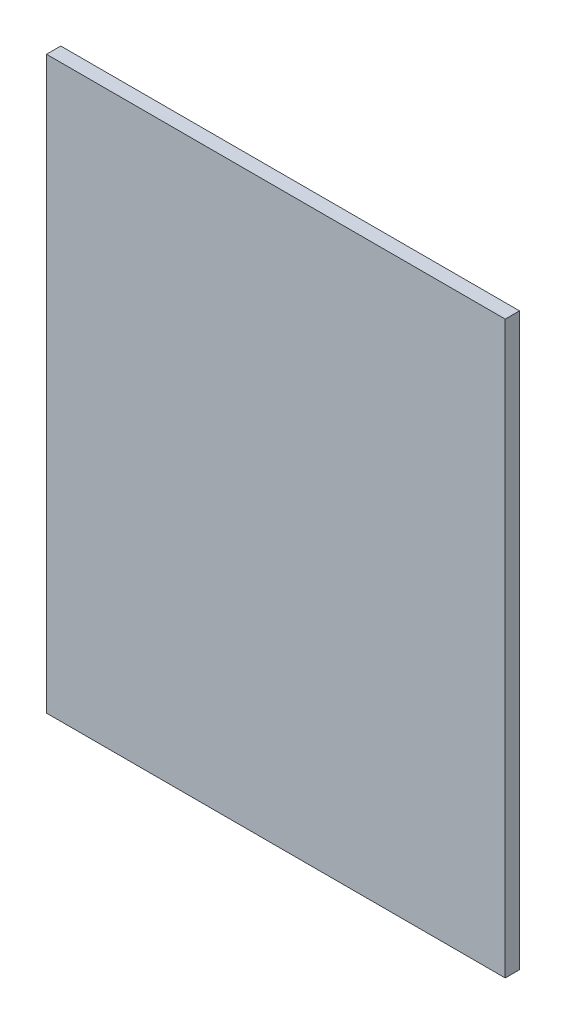
ISO-10303-21;
HEADER;
FILE_DESCRIPTION(('STEP AP214'),'2;1');
FILE_NAME('part.step','',(''),(''),'','','');
FILE_SCHEMA(('AUTOMOTIVE_DESIGN { 1 0 10303 214 1 1 1 1 }'));
ENDSEC;
DATA;
#1=APPLICATION_CONTEXT('core data for automotive mechanical design processes');
#2=APPLICATION_PROTOCOL_DEFINITION('international standard','automotive_design',2000,#1);
#3=PRODUCT_CONTEXT('',#1,'mechanical');
#4=PRODUCT('Part','Part','',(#3));
#5=PRODUCT_RELATED_PRODUCT_CATEGORY('part','',(#4));
#6=PRODUCT_DEFINITION_FORMATION('','',#4);
#7=PRODUCT_DEFINITION_CONTEXT('part definition',#1,'design');
#8=PRODUCT_DEFINITION('design','',#6,#7);
#9=PRODUCT_DEFINITION_SHAPE('','',#8);
#10=(LENGTH_UNIT() NAMED_UNIT(*) SI_UNIT(.MILLI.,.METRE.));
#11=(NAMED_UNIT(*) PLANE_ANGLE_UNIT() SI_UNIT($,.RADIAN.));
#12=(NAMED_UNIT(*) SI_UNIT($,.STERADIAN.) SOLID_ANGLE_UNIT());
#13=UNCERTAINTY_MEASURE_WITH_UNIT(LENGTH_MEASURE(1.E-05),#10,'distance_accuracy_value','');
#14=(GEOMETRIC_REPRESENTATION_CONTEXT(3) GLOBAL_UNCERTAINTY_ASSIGNED_CONTEXT((#13)) GLOBAL_UNIT_ASSIGNED_CONTEXT((#10,
#11,#12)) REPRESENTATION_CONTEXT('',''));
#15=CARTESIAN_POINT('',(0.,0.,0.));
#16=DIRECTION('',(0.,0.,1.));
#17=DIRECTION('',(1.,0.,0.));
#18=AXIS2_PLACEMENT_3D('',#15,#16,#17);
#19=CARTESIAN_POINT('',(-0.476620385333554,100.,8.74094370282377));
#20=DIRECTION('',(1.,0.,0.));
#21=DIRECTION('',(0.,0.,-1.));
#22=AXIS2_PLACEMENT_3D('',#19,#20,#21);
#23=PLANE('',#22);
#24=DIRECTION('',(0.,0.,1.));
#25=VECTOR('',#24,1.);
#26=CARTESIAN_POINT('',(-0.476620385333554,0.,8.74094370282377));
#27=LINE('',#26,#25);
#28=CARTESIAN_POINT('',(-0.476620385333554,0.,8.74094370282377));
#29=VERTEX_POINT('',#28);
#30=CARTESIAN_POINT('',(-0.476620385333554,0.,11.2409437028238));
#31=VERTEX_POINT('',#30);
#32=EDGE_CURVE('E94',#29,#31,#27,.T.);
#33=ORIENTED_EDGE('',*,*,#32,.T.);
#34=DIRECTION('',(0.,-1.,0.));
#35=VECTOR('',#34,1.);
#36=CARTESIAN_POINT('',(-0.476620385333554,100.,11.2409437028238));
#37=LINE('',#36,#35);
#38=CARTESIAN_POINT('',(-0.476620385333554,100.,11.2409437028238));
#39=VERTEX_POINT('',#38);
#40=EDGE_CURVE('E11',#39,#31,#37,.T.);
#41=ORIENTED_EDGE('',*,*,#40,.F.);
#42=DIRECTION('',(0.,0.,1.));
#43=VECTOR('',#42,1.);
#44=CARTESIAN_POINT('',(-0.476620385333554,100.,8.74094370282377));
#45=LINE('',#44,#43);
#46=CARTESIAN_POINT('',(-0.476620385333554,100.,8.74094370282377));
#47=VERTEX_POINT('',#46);
#48=EDGE_CURVE('E82',#47,#39,#45,.T.);
#49=ORIENTED_EDGE('',*,*,#48,.F.);
#50=DIRECTION('',(0.,-1.,0.));
#51=VECTOR('',#50,1.);
#52=CARTESIAN_POINT('',(-0.476620385333554,100.,8.74094370282377));
#53=LINE('',#52,#51);
#54=EDGE_CURVE('E90',#47,#29,#53,.T.);
#55=ORIENTED_EDGE('',*,*,#54,.T.);
#56=EDGE_LOOP('',(#33,#41,#49,#55));
#57=FACE_BOUND('',#56,.T.);
#58=ADVANCED_FACE('F31',(#57),#23,.F.);
#59=CARTESIAN_POINT('',(-0.476620385333554,100.,11.2409437028238));
#60=DIRECTION('',(0.,0.,-1.));
#61=DIRECTION('',(-1.,0.,0.));
#62=AXIS2_PLACEMENT_3D('',#59,#60,#61);
#63=PLANE('',#62);
#64=DIRECTION('',(1.,0.,0.));
#65=VECTOR('',#64,1.);
#66=CARTESIAN_POINT('',(-0.476620385333554,0.,11.2409437028238));
#67=LINE('',#66,#65);
#68=CARTESIAN_POINT('',(79.913629555421,0.,11.2409437028238));
#69=VERTEX_POINT('',#68);
#70=EDGE_CURVE('E86',#31,#69,#67,.T.);
#71=ORIENTED_EDGE('',*,*,#70,.T.);
#72=DIRECTION('',(0.,-1.,0.));
#73=VECTOR('',#72,1.);
#74=CARTESIAN_POINT('',(79.913629555421,100.,11.2409437028238));
#75=LINE('',#74,#73);
#76=CARTESIAN_POINT('',(79.913629555421,100.,11.2409437028238));
#77=VERTEX_POINT('',#76);
#78=EDGE_CURVE('E39',#77,#69,#75,.T.);
#79=ORIENTED_EDGE('',*,*,#78,.F.);
#80=DIRECTION('',(1.,0.,0.));
#81=VECTOR('',#80,1.);
#82=CARTESIAN_POINT('',(-0.476620385333554,100.,11.2409437028238));
#83=LINE('',#82,#81);
#84=EDGE_CURVE('E77',#39,#77,#83,.T.);
#85=ORIENTED_EDGE('',*,*,#84,.F.);
#86=ORIENTED_EDGE('',*,*,#40,.T.);
#87=EDGE_LOOP('',(#71,#79,#85,#86));
#88=FACE_BOUND('',#87,.T.);
#89=ADVANCED_FACE('F85',(#88),#63,.F.);
#90=CARTESIAN_POINT('',(79.913629555421,100.,8.74094370282377));
#91=DIRECTION('',(-1.,0.,0.));
#92=DIRECTION('',(0.,0.,1.));
#93=AXIS2_PLACEMENT_3D('',#90,#91,#92);
#94=PLANE('',#93);
#95=DIRECTION('',(0.,0.,-1.));
#96=VECTOR('',#95,1.);
#97=CARTESIAN_POINT('',(79.913629555421,0.,8.74094370282377));
#98=LINE('',#97,#96);
#99=CARTESIAN_POINT('',(79.913629555421,0.,8.74094370282377));
#100=VERTEX_POINT('',#99);
#101=EDGE_CURVE('E64',#69,#100,#98,.T.);
#102=ORIENTED_EDGE('',*,*,#101,.T.);
#103=DIRECTION('',(0.,-1.,0.));
#104=VECTOR('',#103,1.);
#105=CARTESIAN_POINT('',(79.913629555421,100.,8.74094370282377));
#106=LINE('',#105,#104);
#107=CARTESIAN_POINT('',(79.913629555421,100.,8.74094370282377));
#108=VERTEX_POINT('',#107);
#109=EDGE_CURVE('E87',#108,#100,#106,.T.);
#110=ORIENTED_EDGE('',*,*,#109,.F.);
#111=DIRECTION('',(0.,0.,-1.));
#112=VECTOR('',#111,1.);
#113=CARTESIAN_POINT('',(79.913629555421,100.,8.74094370282377));
#114=LINE('',#113,#112);
#115=EDGE_CURVE('E80',#77,#108,#114,.T.);
#116=ORIENTED_EDGE('',*,*,#115,.F.);
#117=ORIENTED_EDGE('',*,*,#78,.T.);
#118=EDGE_LOOP('',(#102,#110,#116,#117));
#119=FACE_BOUND('',#118,.T.);
#120=ADVANCED_FACE('F88',(#119),#94,.F.);
#121=CARTESIAN_POINT('',(-0.476620385333554,100.,8.74094370282377));
#122=DIRECTION('',(0.,0.,1.));
#123=DIRECTION('',(1.,0.,0.));
#124=AXIS2_PLACEMENT_3D('',#121,#122,#123);
#125=PLANE('',#124);
#126=DIRECTION('',(-1.,0.,0.));
#127=VECTOR('',#126,1.);
#128=CARTESIAN_POINT('',(-0.476620385333554,0.,8.74094370282377));
#129=LINE('',#128,#127);
#130=EDGE_CURVE('E70',#100,#29,#129,.T.);
#131=ORIENTED_EDGE('',*,*,#130,.T.);
#132=ORIENTED_EDGE('',*,*,#54,.F.);
#133=DIRECTION('',(-1.,0.,0.));
#134=VECTOR('',#133,1.);
#135=CARTESIAN_POINT('',(-0.476620385333554,100.,8.74094370282377));
#136=LINE('',#135,#134);
#137=EDGE_CURVE('E47',#108,#47,#136,.T.);
#138=ORIENTED_EDGE('',*,*,#137,.F.);
#139=ORIENTED_EDGE('',*,*,#109,.T.);
#140=EDGE_LOOP('',(#131,#132,#138,#139));
#141=FACE_BOUND('',#140,.T.);
#142=ADVANCED_FACE('F101',(#141),#125,.F.);
#143=CARTESIAN_POINT('',(-0.476620385333554,100.,11.2409437028238));
#144=DIRECTION('',(0.,1.,0.));
#145=DIRECTION('',(0.,0.,1.));
#146=AXIS2_PLACEMENT_3D('',#143,#144,#145);
#147=PLANE('',#146);
#148=ORIENTED_EDGE('',*,*,#48,.T.);
#149=ORIENTED_EDGE('',*,*,#84,.T.);
#150=ORIENTED_EDGE('',*,*,#115,.T.);
#151=ORIENTED_EDGE('',*,*,#137,.T.);
#152=EDGE_LOOP('',(#148,#149,#150,#151));
#153=FACE_BOUND('',#152,.T.);
#154=ADVANCED_FACE('F78',(#153),#147,.T.);
#155=CARTESIAN_POINT('',(-0.476620385333554,0.,11.2409437028238));
#156=DIRECTION('',(0.,1.,0.));
#157=DIRECTION('',(0.,0.,1.));
#158=AXIS2_PLACEMENT_3D('',#155,#156,#157);
#159=PLANE('',#158);
#160=ORIENTED_EDGE('',*,*,#32,.F.);
#161=ORIENTED_EDGE('',*,*,#130,.F.);
#162=ORIENTED_EDGE('',*,*,#101,.F.);
#163=ORIENTED_EDGE('',*,*,#70,.F.);
#164=EDGE_LOOP('',(#160,#161,#162,#163));
#165=FACE_BOUND('',#164,.T.);
#166=ADVANCED_FACE('F104',(#165),#159,.F.);
#167=CLOSED_SHELL('',(#58,#89,#120,#142,#154,#166));
#168=MANIFOLD_SOLID_BREP('B2',#167);
#169=ADVANCED_BREP_SHAPE_REPRESENTATION('',(#18,#168),#14);
#170=SHAPE_DEFINITION_REPRESENTATION(#9,#169);
ENDSEC;
END-ISO-10303-21;
